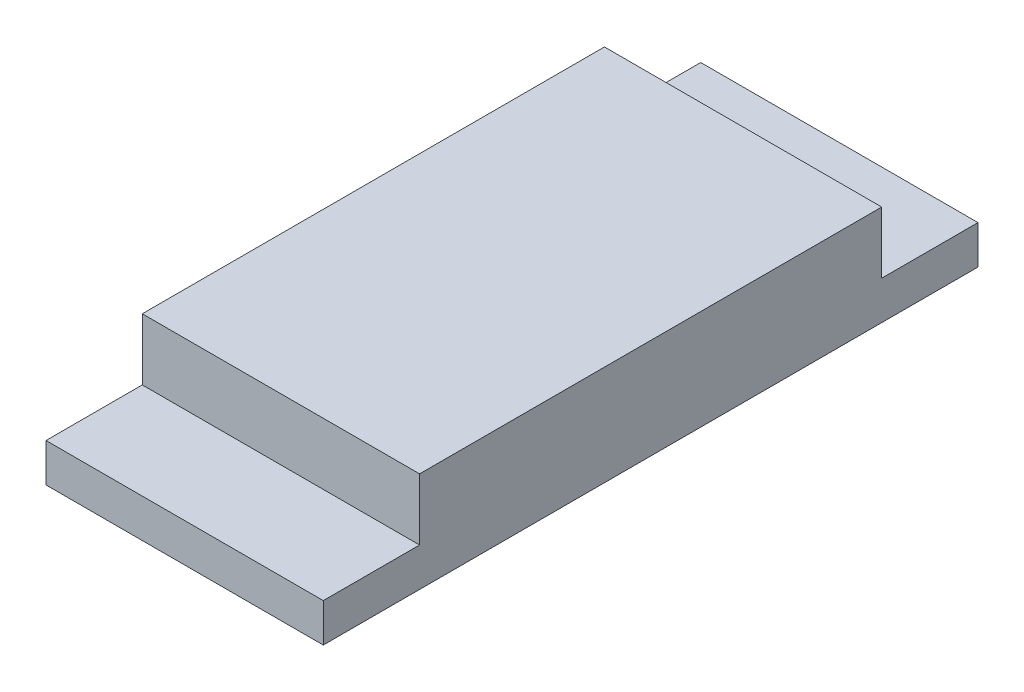
ISO-10303-21;
HEADER;
FILE_DESCRIPTION(('STEP AP214'),'2;1');
FILE_NAME('part.step','',(''),(''),'','','');
FILE_SCHEMA(('AUTOMOTIVE_DESIGN { 1 0 10303 214 1 1 1 1 }'));
ENDSEC;
DATA;
#1=APPLICATION_CONTEXT('core data for automotive mechanical design processes');
#2=APPLICATION_PROTOCOL_DEFINITION('international standard','automotive_design',2000,#1);
#3=PRODUCT_CONTEXT('',#1,'mechanical');
#4=PRODUCT('Part','Part','',(#3));
#5=PRODUCT_RELATED_PRODUCT_CATEGORY('part','',(#4));
#6=PRODUCT_DEFINITION_FORMATION('','',#4);
#7=PRODUCT_DEFINITION_CONTEXT('part definition',#1,'design');
#8=PRODUCT_DEFINITION('design','',#6,#7);
#9=PRODUCT_DEFINITION_SHAPE('','',#8);
#10=(LENGTH_UNIT() NAMED_UNIT(*) SI_UNIT(.MILLI.,.METRE.));
#11=(NAMED_UNIT(*) PLANE_ANGLE_UNIT() SI_UNIT($,.RADIAN.));
#12=(NAMED_UNIT(*) SI_UNIT($,.STERADIAN.) SOLID_ANGLE_UNIT());
#13=UNCERTAINTY_MEASURE_WITH_UNIT(LENGTH_MEASURE(1.E-05),#10,'distance_accuracy_value','');
#14=(GEOMETRIC_REPRESENTATION_CONTEXT(3) GLOBAL_UNCERTAINTY_ASSIGNED_CONTEXT((#13)) GLOBAL_UNIT_ASSIGNED_CONTEXT((#10,
#11,#12)) REPRESENTATION_CONTEXT('',''));
#15=CARTESIAN_POINT('',(0.,0.,0.));
#16=DIRECTION('',(0.,0.,1.));
#17=DIRECTION('',(1.,0.,0.));
#18=AXIS2_PLACEMENT_3D('',#15,#16,#17);
#19=CARTESIAN_POINT('',(36.,5.,0.));
#20=DIRECTION('',(0.,0.,-1.));
#21=DIRECTION('',(0.,1.,0.));
#22=AXIS2_PLACEMENT_3D('',#19,#20,#21);
#23=PLANE('',#22);
#24=DIRECTION('',(0.,-1.,0.));
#25=VECTOR('',#24,1.);
#26=CARTESIAN_POINT('',(0.,5.,0.));
#27=LINE('',#26,#25);
#28=CARTESIAN_POINT('',(0.,5.,0.));
#29=VERTEX_POINT('',#28);
#30=CARTESIAN_POINT('',(0.,0.,0.));
#31=VERTEX_POINT('',#30);
#32=EDGE_CURVE('E139',#29,#31,#27,.T.);
#33=ORIENTED_EDGE('',*,*,#32,.T.);
#34=DIRECTION('',(-1.,0.,0.));
#35=VECTOR('',#34,1.);
#36=CARTESIAN_POINT('',(36.,0.,0.));
#37=LINE('',#36,#35);
#38=CARTESIAN_POINT('',(36.,0.,0.));
#39=VERTEX_POINT('',#38);
#40=EDGE_CURVE('E11',#39,#31,#37,.T.);
#41=ORIENTED_EDGE('',*,*,#40,.F.);
#42=DIRECTION('',(0.,-1.,0.));
#43=VECTOR('',#42,1.);
#44=CARTESIAN_POINT('',(36.,5.,0.));
#45=LINE('',#44,#43);
#46=CARTESIAN_POINT('',(36.,5.,0.));
#47=VERTEX_POINT('',#46);
#48=EDGE_CURVE('E157',#47,#39,#45,.T.);
#49=ORIENTED_EDGE('',*,*,#48,.F.);
#50=DIRECTION('',(-1.,0.,0.));
#51=VECTOR('',#50,1.);
#52=CARTESIAN_POINT('',(36.,5.,0.));
#53=LINE('',#52,#51);
#54=EDGE_CURVE('E135',#47,#29,#53,.T.);
#55=ORIENTED_EDGE('',*,*,#54,.T.);
#56=EDGE_LOOP('',(#33,#41,#49,#55));
#57=FACE_BOUND('',#56,.T.);
#58=ADVANCED_FACE('F41',(#57),#23,.F.);
#59=CARTESIAN_POINT('',(36.,0.,0.));
#60=DIRECTION('',(0.,1.,0.));
#61=DIRECTION('',(0.,0.,1.));
#62=AXIS2_PLACEMENT_3D('',#59,#60,#61);
#63=PLANE('',#62);
#64=DIRECTION('',(0.,0.,-1.));
#65=VECTOR('',#64,1.);
#66=CARTESIAN_POINT('',(0.,0.,0.));
#67=LINE('',#66,#65);
#68=CARTESIAN_POINT('',(0.,0.,-85.));
#69=VERTEX_POINT('',#68);
#70=EDGE_CURVE('E142',#31,#69,#67,.T.);
#71=ORIENTED_EDGE('',*,*,#70,.T.);
#72=DIRECTION('',(-1.,0.,0.));
#73=VECTOR('',#72,1.);
#74=CARTESIAN_POINT('',(36.,0.,-85.));
#75=LINE('',#74,#73);
#76=CARTESIAN_POINT('',(36.,0.,-85.));
#77=VERTEX_POINT('',#76);
#78=EDGE_CURVE('E49',#77,#69,#75,.T.);
#79=ORIENTED_EDGE('',*,*,#78,.F.);
#80=DIRECTION('',(0.,0.,-1.));
#81=VECTOR('',#80,1.);
#82=CARTESIAN_POINT('',(36.,0.,0.));
#83=LINE('',#82,#81);
#84=EDGE_CURVE('E102',#39,#77,#83,.T.);
#85=ORIENTED_EDGE('',*,*,#84,.F.);
#86=ORIENTED_EDGE('',*,*,#40,.T.);
#87=EDGE_LOOP('',(#71,#79,#85,#86));
#88=FACE_BOUND('',#87,.T.);
#89=ADVANCED_FACE('F194',(#88),#63,.F.);
#90=CARTESIAN_POINT('',(36.,0.,-85.));
#91=DIRECTION('',(0.,0.,1.));
#92=DIRECTION('',(1.,0.,0.));
#93=AXIS2_PLACEMENT_3D('',#90,#91,#92);
#94=PLANE('',#93);
#95=DIRECTION('',(0.,1.,0.));
#96=VECTOR('',#95,1.);
#97=CARTESIAN_POINT('',(0.,0.,-85.));
#98=LINE('',#97,#96);
#99=CARTESIAN_POINT('',(0.,5.00000000000001,-85.));
#100=VERTEX_POINT('',#99);
#101=EDGE_CURVE('E145',#69,#100,#98,.T.);
#102=ORIENTED_EDGE('',*,*,#101,.T.);
#103=DIRECTION('',(-1.,0.,0.));
#104=VECTOR('',#103,1.);
#105=CARTESIAN_POINT('',(36.,5.00000000000001,-85.));
#106=LINE('',#105,#104);
#107=CARTESIAN_POINT('',(36.,5.00000000000001,-85.));
#108=VERTEX_POINT('',#107);
#109=EDGE_CURVE('E166',#108,#100,#106,.T.);
#110=ORIENTED_EDGE('',*,*,#109,.F.);
#111=DIRECTION('',(0.,1.,0.));
#112=VECTOR('',#111,1.);
#113=CARTESIAN_POINT('',(36.,0.,-85.));
#114=LINE('',#113,#112);
#115=EDGE_CURVE('E174',#77,#108,#114,.T.);
#116=ORIENTED_EDGE('',*,*,#115,.F.);
#117=ORIENTED_EDGE('',*,*,#78,.T.);
#118=EDGE_LOOP('',(#102,#110,#116,#117));
#119=FACE_BOUND('',#118,.T.);
#120=ADVANCED_FACE('F172',(#119),#94,.F.);
#121=CARTESIAN_POINT('',(36.,5.00000000000001,-85.));
#122=DIRECTION('',(0.,-1.,0.));
#123=DIRECTION('',(0.,0.,-1.));
#124=AXIS2_PLACEMENT_3D('',#121,#122,#123);
#125=PLANE('',#124);
#126=DIRECTION('',(0.,0.,1.));
#127=VECTOR('',#126,1.);
#128=CARTESIAN_POINT('',(0.,5.00000000000001,-85.));
#129=LINE('',#128,#127);
#130=CARTESIAN_POINT('',(0.,5.00000000000001,-72.5));
#131=VERTEX_POINT('',#130);
#132=EDGE_CURVE('E147',#100,#131,#129,.T.);
#133=ORIENTED_EDGE('',*,*,#132,.T.);
#134=DIRECTION('',(-1.,0.,0.));
#135=VECTOR('',#134,1.);
#136=CARTESIAN_POINT('',(36.,5.00000000000001,-72.5));
#137=LINE('',#136,#135);
#138=CARTESIAN_POINT('',(36.,5.00000000000001,-72.5));
#139=VERTEX_POINT('',#138);
#140=EDGE_CURVE('E162',#139,#131,#137,.T.);
#141=ORIENTED_EDGE('',*,*,#140,.F.);
#142=DIRECTION('',(0.,0.,1.));
#143=VECTOR('',#142,1.);
#144=CARTESIAN_POINT('',(36.,5.00000000000001,-85.));
#145=LINE('',#144,#143);
#146=EDGE_CURVE('E186',#108,#139,#145,.T.);
#147=ORIENTED_EDGE('',*,*,#146,.F.);
#148=ORIENTED_EDGE('',*,*,#109,.T.);
#149=EDGE_LOOP('',(#133,#141,#147,#148));
#150=FACE_BOUND('',#149,.T.);
#151=ADVANCED_FACE('F182',(#150),#125,.F.);
#152=CARTESIAN_POINT('',(36.,5.00000000000001,-72.5));
#153=DIRECTION('',(0.,0.,1.));
#154=DIRECTION('',(1.,0.,0.));
#155=AXIS2_PLACEMENT_3D('',#152,#153,#154);
#156=PLANE('',#155);
#157=DIRECTION('',(0.,1.,0.));
#158=VECTOR('',#157,1.);
#159=CARTESIAN_POINT('',(0.,5.00000000000001,-72.5));
#160=LINE('',#159,#158);
#161=CARTESIAN_POINT('',(0.,13.,-72.5));
#162=VERTEX_POINT('',#161);
#163=EDGE_CURVE('E150',#131,#162,#160,.T.);
#164=ORIENTED_EDGE('',*,*,#163,.T.);
#165=DIRECTION('',(-1.,0.,0.));
#166=VECTOR('',#165,1.);
#167=CARTESIAN_POINT('',(36.,13.,-72.5));
#168=LINE('',#167,#166);
#169=CARTESIAN_POINT('',(36.,13.,-72.5));
#170=VERTEX_POINT('',#169);
#171=EDGE_CURVE('E130',#170,#162,#168,.T.);
#172=ORIENTED_EDGE('',*,*,#171,.F.);
#173=DIRECTION('',(0.,1.,0.));
#174=VECTOR('',#173,1.);
#175=CARTESIAN_POINT('',(36.,5.00000000000001,-72.5));
#176=LINE('',#175,#174);
#177=EDGE_CURVE('E121',#139,#170,#176,.T.);
#178=ORIENTED_EDGE('',*,*,#177,.F.);
#179=ORIENTED_EDGE('',*,*,#140,.T.);
#180=EDGE_LOOP('',(#164,#172,#178,#179));
#181=FACE_BOUND('',#180,.T.);
#182=ADVANCED_FACE('F185',(#181),#156,.F.);
#183=CARTESIAN_POINT('',(36.,13.,-72.5));
#184=DIRECTION('',(0.,-1.,0.));
#185=DIRECTION('',(0.,0.,-1.));
#186=AXIS2_PLACEMENT_3D('',#183,#184,#185);
#187=PLANE('',#186);
#188=DIRECTION('',(0.,0.,1.));
#189=VECTOR('',#188,1.);
#190=CARTESIAN_POINT('',(0.,13.,-72.5));
#191=LINE('',#190,#189);
#192=CARTESIAN_POINT('',(0.,13.,-12.5));
#193=VERTEX_POINT('',#192);
#194=EDGE_CURVE('E129',#162,#193,#191,.T.);
#195=ORIENTED_EDGE('',*,*,#194,.T.);
#196=DIRECTION('',(-1.,0.,0.));
#197=VECTOR('',#196,1.);
#198=CARTESIAN_POINT('',(36.,13.,-12.5));
#199=LINE('',#198,#197);
#200=CARTESIAN_POINT('',(36.,13.,-12.5));
#201=VERTEX_POINT('',#200);
#202=EDGE_CURVE('E126',#201,#193,#199,.T.);
#203=ORIENTED_EDGE('',*,*,#202,.F.);
#204=DIRECTION('',(0.,0.,1.));
#205=VECTOR('',#204,1.);
#206=CARTESIAN_POINT('',(36.,13.,-72.5));
#207=LINE('',#206,#205);
#208=EDGE_CURVE('E115',#170,#201,#207,.T.);
#209=ORIENTED_EDGE('',*,*,#208,.F.);
#210=ORIENTED_EDGE('',*,*,#171,.T.);
#211=EDGE_LOOP('',(#195,#203,#209,#210));
#212=FACE_BOUND('',#211,.T.);
#213=ADVANCED_FACE('F127',(#212),#187,.F.);
#214=CARTESIAN_POINT('',(36.,13.,-12.5));
#215=DIRECTION('',(0.,0.,-1.));
#216=DIRECTION('',(0.,1.,0.));
#217=AXIS2_PLACEMENT_3D('',#214,#215,#216);
#218=PLANE('',#217);
#219=DIRECTION('',(0.,-1.,0.));
#220=VECTOR('',#219,1.);
#221=CARTESIAN_POINT('',(0.,13.,-12.5));
#222=LINE('',#221,#220);
#223=CARTESIAN_POINT('',(0.,5.,-12.5));
#224=VERTEX_POINT('',#223);
#225=EDGE_CURVE('E88',#193,#224,#222,.T.);
#226=ORIENTED_EDGE('',*,*,#225,.T.);
#227=DIRECTION('',(-1.,0.,0.));
#228=VECTOR('',#227,1.);
#229=CARTESIAN_POINT('',(36.,5.,-12.5));
#230=LINE('',#229,#228);
#231=CARTESIAN_POINT('',(36.,5.,-12.5));
#232=VERTEX_POINT('',#231);
#233=EDGE_CURVE('E131',#232,#224,#230,.T.);
#234=ORIENTED_EDGE('',*,*,#233,.F.);
#235=DIRECTION('',(0.,-1.,0.));
#236=VECTOR('',#235,1.);
#237=CARTESIAN_POINT('',(36.,13.,-12.5));
#238=LINE('',#237,#236);
#239=EDGE_CURVE('E119',#201,#232,#238,.T.);
#240=ORIENTED_EDGE('',*,*,#239,.F.);
#241=ORIENTED_EDGE('',*,*,#202,.T.);
#242=EDGE_LOOP('',(#226,#234,#240,#241));
#243=FACE_BOUND('',#242,.T.);
#244=ADVANCED_FACE('F133',(#243),#218,.F.);
#245=CARTESIAN_POINT('',(36.,5.,-12.5));
#246=DIRECTION('',(0.,-1.,0.));
#247=DIRECTION('',(0.,0.,-1.));
#248=AXIS2_PLACEMENT_3D('',#245,#246,#247);
#249=PLANE('',#248);
#250=DIRECTION('',(0.,0.,1.));
#251=VECTOR('',#250,1.);
#252=CARTESIAN_POINT('',(0.,5.,-12.5));
#253=LINE('',#252,#251);
#254=EDGE_CURVE('E94',#224,#29,#253,.T.);
#255=ORIENTED_EDGE('',*,*,#254,.T.);
#256=ORIENTED_EDGE('',*,*,#54,.F.);
#257=DIRECTION('',(0.,0.,1.));
#258=VECTOR('',#257,1.);
#259=CARTESIAN_POINT('',(36.,5.,-12.5));
#260=LINE('',#259,#258);
#261=EDGE_CURVE('E57',#232,#47,#260,.T.);
#262=ORIENTED_EDGE('',*,*,#261,.F.);
#263=ORIENTED_EDGE('',*,*,#233,.T.);
#264=EDGE_LOOP('',(#255,#256,#262,#263));
#265=FACE_BOUND('',#264,.T.);
#266=ADVANCED_FACE('F210',(#265),#249,.F.);
#267=CARTESIAN_POINT('',(36.,0.,0.));
#268=DIRECTION('',(1.,0.,0.));
#269=DIRECTION('',(0.,0.,-1.));
#270=AXIS2_PLACEMENT_3D('',#267,#268,#269);
#271=PLANE('',#270);
#272=ORIENTED_EDGE('',*,*,#48,.T.);
#273=ORIENTED_EDGE('',*,*,#84,.T.);
#274=ORIENTED_EDGE('',*,*,#115,.T.);
#275=ORIENTED_EDGE('',*,*,#146,.T.);
#276=ORIENTED_EDGE('',*,*,#177,.T.);
#277=ORIENTED_EDGE('',*,*,#208,.T.);
#278=ORIENTED_EDGE('',*,*,#239,.T.);
#279=ORIENTED_EDGE('',*,*,#261,.T.);
#280=EDGE_LOOP('',(#272,#273,#274,#275,#276,#277,#278,#279));
#281=FACE_BOUND('',#280,.T.);
#282=ADVANCED_FACE('F117',(#281),#271,.T.);
#283=CARTESIAN_POINT('',(0.,0.,0.));
#284=DIRECTION('',(1.,0.,0.));
#285=DIRECTION('',(0.,0.,-1.));
#286=AXIS2_PLACEMENT_3D('',#283,#284,#285);
#287=PLANE('',#286);
#288=ORIENTED_EDGE('',*,*,#32,.F.);
#289=ORIENTED_EDGE('',*,*,#254,.F.);
#290=ORIENTED_EDGE('',*,*,#225,.F.);
#291=ORIENTED_EDGE('',*,*,#194,.F.);
#292=ORIENTED_EDGE('',*,*,#163,.F.);
#293=ORIENTED_EDGE('',*,*,#132,.F.);
#294=ORIENTED_EDGE('',*,*,#101,.F.);
#295=ORIENTED_EDGE('',*,*,#70,.F.);
#296=EDGE_LOOP('',(#288,#289,#290,#291,#292,#293,#294,#295));
#297=FACE_BOUND('',#296,.T.);
#298=ADVANCED_FACE('F178',(#297),#287,.F.);
#299=CLOSED_SHELL('',(#58,#89,#120,#151,#182,#213,#244,#266,#282,#298));
#300=MANIFOLD_SOLID_BREP('B2',#299);
#301=ADVANCED_BREP_SHAPE_REPRESENTATION('',(#18,#300),#14);
#302=SHAPE_DEFINITION_REPRESENTATION(#9,#301);
ENDSEC;
END-ISO-10303-21;
